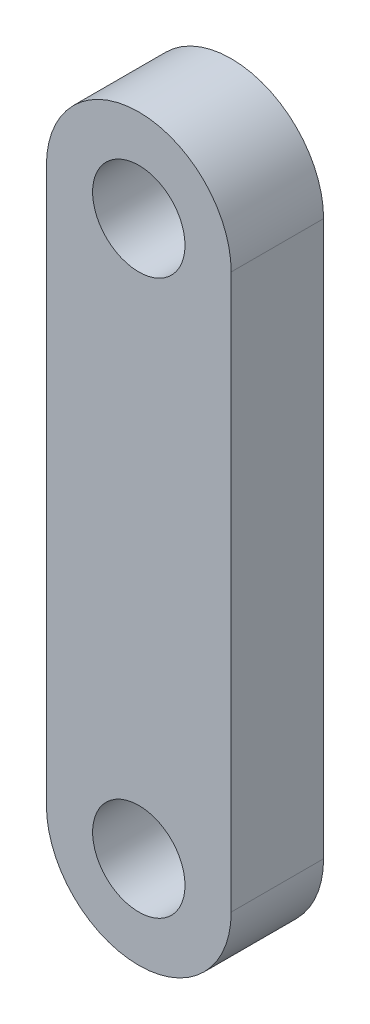
ISO-10303-21;
HEADER;
FILE_DESCRIPTION(('STEP AP214'),'2;1');
FILE_NAME('part.step','',(''),(''),'','','');
FILE_SCHEMA(('AUTOMOTIVE_DESIGN { 1 0 10303 214 1 1 1 1 }'));
ENDSEC;
DATA;
#1=APPLICATION_CONTEXT('core data for automotive mechanical design processes');
#2=APPLICATION_PROTOCOL_DEFINITION('international standard','automotive_design',2000,#1);
#3=PRODUCT_CONTEXT('',#1,'mechanical');
#4=PRODUCT('Part','Part','',(#3));
#5=PRODUCT_RELATED_PRODUCT_CATEGORY('part','',(#4));
#6=PRODUCT_DEFINITION_FORMATION('','',#4);
#7=PRODUCT_DEFINITION_CONTEXT('part definition',#1,'design');
#8=PRODUCT_DEFINITION('design','',#6,#7);
#9=PRODUCT_DEFINITION_SHAPE('','',#8);
#10=(LENGTH_UNIT() NAMED_UNIT(*) SI_UNIT(.MILLI.,.METRE.));
#11=(NAMED_UNIT(*) PLANE_ANGLE_UNIT() SI_UNIT($,.RADIAN.));
#12=(NAMED_UNIT(*) SI_UNIT($,.STERADIAN.) SOLID_ANGLE_UNIT());
#13=UNCERTAINTY_MEASURE_WITH_UNIT(LENGTH_MEASURE(1.E-05),#10,'distance_accuracy_value','');
#14=(GEOMETRIC_REPRESENTATION_CONTEXT(3) GLOBAL_UNCERTAINTY_ASSIGNED_CONTEXT((#13)) GLOBAL_UNIT_ASSIGNED_CONTEXT((#10,
#11,#12)) REPRESENTATION_CONTEXT('',''));
#15=CARTESIAN_POINT('',(0.,0.,0.));
#16=DIRECTION('',(0.,0.,1.));
#17=DIRECTION('',(1.,0.,0.));
#18=AXIS2_PLACEMENT_3D('',#15,#16,#17);
#19=CARTESIAN_POINT('',(0.,0.,10.));
#20=DIRECTION('',(0.,0.,1.));
#21=DIRECTION('',(1.,0.,0.));
#22=AXIS2_PLACEMENT_3D('',#19,#20,#21);
#23=PLANE('',#22);
#24=CARTESIAN_POINT('',(0.,0.,10.));
#25=DIRECTION('',(0.,0.,1.));
#26=DIRECTION('',(1.,0.,0.));
#27=AXIS2_PLACEMENT_3D('',#24,#25,#26);
#28=CIRCLE('',#27,2.5);
#29=CARTESIAN_POINT('',(2.5,0.,10.));
#30=VERTEX_POINT('',#29);
#31=EDGE_CURVE('E106',#30,#30,#28,.T.);
#32=ORIENTED_EDGE('',*,*,#31,.F.);
#33=EDGE_LOOP('',(#32));
#34=FACE_BOUND('',#33,.T.);
#35=CARTESIAN_POINT('',(0.,0.,10.));
#36=DIRECTION('',(0.,0.,1.));
#37=DIRECTION('',(1.,0.,0.));
#38=AXIS2_PLACEMENT_3D('',#35,#36,#37);
#39=CIRCLE('',#38,5.);
#40=CARTESIAN_POINT('',(-5.,0.,10.));
#41=VERTEX_POINT('',#40);
#42=CARTESIAN_POINT('',(5.,0.,10.));
#43=VERTEX_POINT('',#42);
#44=EDGE_CURVE('E91',#41,#43,#39,.T.);
#45=ORIENTED_EDGE('',*,*,#44,.T.);
#46=DIRECTION('',(0.,1.,0.));
#47=VECTOR('',#46,1.);
#48=CARTESIAN_POINT('',(5.,0.,10.));
#49=LINE('',#48,#47);
#50=CARTESIAN_POINT('',(5.,30.,10.));
#51=VERTEX_POINT('',#50);
#52=EDGE_CURVE('E86',#43,#51,#49,.T.);
#53=ORIENTED_EDGE('',*,*,#52,.T.);
#54=CARTESIAN_POINT('',(0.,30.,10.));
#55=DIRECTION('',(0.,0.,1.));
#56=DIRECTION('',(1.,0.,0.));
#57=AXIS2_PLACEMENT_3D('',#54,#55,#56);
#58=CIRCLE('',#57,5.);
#59=CARTESIAN_POINT('',(-5.,30.,10.));
#60=VERTEX_POINT('',#59);
#61=EDGE_CURVE('E89',#51,#60,#58,.T.);
#62=ORIENTED_EDGE('',*,*,#61,.T.);
#63=DIRECTION('',(0.,-1.,0.));
#64=VECTOR('',#63,1.);
#65=CARTESIAN_POINT('',(-5.,0.,10.));
#66=LINE('',#65,#64);
#67=EDGE_CURVE('E56',#60,#41,#66,.T.);
#68=ORIENTED_EDGE('',*,*,#67,.T.);
#69=EDGE_LOOP('',(#45,#53,#62,#68));
#70=FACE_BOUND('',#69,.T.);
#71=CARTESIAN_POINT('',(0.,30.,10.));
#72=DIRECTION('',(0.,0.,1.));
#73=DIRECTION('',(1.,0.,0.));
#74=AXIS2_PLACEMENT_3D('',#71,#72,#73);
#75=CIRCLE('',#74,2.5);
#76=CARTESIAN_POINT('',(2.5,30.,10.));
#77=VERTEX_POINT('',#76);
#78=EDGE_CURVE('E121',#77,#77,#75,.T.);
#79=ORIENTED_EDGE('',*,*,#78,.F.);
#80=EDGE_LOOP('',(#79));
#81=FACE_BOUND('',#80,.T.);
#82=ADVANCED_FACE('F39',(#34,#70,#81),#23,.T.);
#83=CARTESIAN_POINT('',(0.,0.,5.));
#84=DIRECTION('',(0.,0.,1.));
#85=DIRECTION('',(1.,0.,0.));
#86=AXIS2_PLACEMENT_3D('',#83,#84,#85);
#87=PLANE('',#86);
#88=CARTESIAN_POINT('',(0.,0.,5.));
#89=DIRECTION('',(0.,0.,1.));
#90=DIRECTION('',(1.,0.,0.));
#91=AXIS2_PLACEMENT_3D('',#88,#89,#90);
#92=CIRCLE('',#91,5.);
#93=CARTESIAN_POINT('',(-5.,0.,5.));
#94=VERTEX_POINT('',#93);
#95=CARTESIAN_POINT('',(5.,0.,5.));
#96=VERTEX_POINT('',#95);
#97=EDGE_CURVE('E103',#94,#96,#92,.T.);
#98=ORIENTED_EDGE('',*,*,#97,.F.);
#99=DIRECTION('',(0.,-1.,0.));
#100=VECTOR('',#99,1.);
#101=CARTESIAN_POINT('',(-5.,0.,5.));
#102=LINE('',#101,#100);
#103=CARTESIAN_POINT('',(-5.,30.,5.));
#104=VERTEX_POINT('',#103);
#105=EDGE_CURVE('E79',#104,#94,#102,.T.);
#106=ORIENTED_EDGE('',*,*,#105,.F.);
#107=CARTESIAN_POINT('',(0.,30.,5.));
#108=DIRECTION('',(0.,0.,1.));
#109=DIRECTION('',(1.,0.,0.));
#110=AXIS2_PLACEMENT_3D('',#107,#108,#109);
#111=CIRCLE('',#110,5.);
#112=CARTESIAN_POINT('',(5.,30.,5.));
#113=VERTEX_POINT('',#112);
#114=EDGE_CURVE('E73',#113,#104,#111,.T.);
#115=ORIENTED_EDGE('',*,*,#114,.F.);
#116=DIRECTION('',(0.,1.,0.));
#117=VECTOR('',#116,1.);
#118=CARTESIAN_POINT('',(5.,0.,5.));
#119=LINE('',#118,#117);
#120=EDGE_CURVE('E95',#96,#113,#119,.T.);
#121=ORIENTED_EDGE('',*,*,#120,.F.);
#122=EDGE_LOOP('',(#98,#106,#115,#121));
#123=FACE_BOUND('',#122,.T.);
#124=CARTESIAN_POINT('',(0.,0.,5.));
#125=DIRECTION('',(0.,0.,1.));
#126=DIRECTION('',(1.,0.,0.));
#127=AXIS2_PLACEMENT_3D('',#124,#125,#126);
#128=CIRCLE('',#127,2.5);
#129=CARTESIAN_POINT('',(2.5,0.,5.));
#130=VERTEX_POINT('',#129);
#131=EDGE_CURVE('E118',#130,#130,#128,.T.);
#132=ORIENTED_EDGE('',*,*,#131,.T.);
#133=EDGE_LOOP('',(#132));
#134=FACE_BOUND('',#133,.T.);
#135=CARTESIAN_POINT('',(0.,30.,5.));
#136=DIRECTION('',(0.,0.,1.));
#137=DIRECTION('',(1.,0.,0.));
#138=AXIS2_PLACEMENT_3D('',#135,#136,#137);
#139=CIRCLE('',#138,2.5);
#140=CARTESIAN_POINT('',(2.5,30.,5.));
#141=VERTEX_POINT('',#140);
#142=EDGE_CURVE('E124',#141,#141,#139,.T.);
#143=ORIENTED_EDGE('',*,*,#142,.T.);
#144=EDGE_LOOP('',(#143));
#145=FACE_BOUND('',#144,.T.);
#146=ADVANCED_FACE('F114',(#123,#134,#145),#87,.F.);
#147=CARTESIAN_POINT('',(0.,0.,10.));
#148=DIRECTION('',(0.,0.,-1.));
#149=DIRECTION('',(-1.,0.,0.));
#150=AXIS2_PLACEMENT_3D('',#147,#148,#149);
#151=CYLINDRICAL_SURFACE('',#150,5.);
#152=ORIENTED_EDGE('',*,*,#97,.T.);
#153=DIRECTION('',(0.,0.,-1.));
#154=VECTOR('',#153,1.);
#155=CARTESIAN_POINT('',(5.,0.,10.));
#156=LINE('',#155,#154);
#157=EDGE_CURVE('E11',#43,#96,#156,.T.);
#158=ORIENTED_EDGE('',*,*,#157,.F.);
#159=ORIENTED_EDGE('',*,*,#44,.F.);
#160=DIRECTION('',(0.,0.,-1.));
#161=VECTOR('',#160,1.);
#162=CARTESIAN_POINT('',(-5.,0.,10.));
#163=LINE('',#162,#161);
#164=EDGE_CURVE('E99',#41,#94,#163,.T.);
#165=ORIENTED_EDGE('',*,*,#164,.T.);
#166=EDGE_LOOP('',(#152,#158,#159,#165));
#167=FACE_BOUND('',#166,.T.);
#168=ADVANCED_FACE('F41',(#167),#151,.T.);
#169=CARTESIAN_POINT('',(5.,0.,10.));
#170=DIRECTION('',(-1.,0.,0.));
#171=DIRECTION('',(0.,0.,1.));
#172=AXIS2_PLACEMENT_3D('',#169,#170,#171);
#173=PLANE('',#172);
#174=ORIENTED_EDGE('',*,*,#120,.T.);
#175=DIRECTION('',(0.,0.,-1.));
#176=VECTOR('',#175,1.);
#177=CARTESIAN_POINT('',(5.,30.,10.));
#178=LINE('',#177,#176);
#179=EDGE_CURVE('E48',#51,#113,#178,.T.);
#180=ORIENTED_EDGE('',*,*,#179,.F.);
#181=ORIENTED_EDGE('',*,*,#52,.F.);
#182=ORIENTED_EDGE('',*,*,#157,.T.);
#183=EDGE_LOOP('',(#174,#180,#181,#182));
#184=FACE_BOUND('',#183,.T.);
#185=ADVANCED_FACE('F94',(#184),#173,.F.);
#186=CARTESIAN_POINT('',(0.,30.,10.));
#187=DIRECTION('',(0.,0.,-1.));
#188=DIRECTION('',(-1.,0.,0.));
#189=AXIS2_PLACEMENT_3D('',#186,#187,#188);
#190=CYLINDRICAL_SURFACE('',#189,5.);
#191=ORIENTED_EDGE('',*,*,#114,.T.);
#192=DIRECTION('',(0.,0.,-1.));
#193=VECTOR('',#192,1.);
#194=CARTESIAN_POINT('',(-5.,30.,10.));
#195=LINE('',#194,#193);
#196=EDGE_CURVE('E96',#60,#104,#195,.T.);
#197=ORIENTED_EDGE('',*,*,#196,.F.);
#198=ORIENTED_EDGE('',*,*,#61,.F.);
#199=ORIENTED_EDGE('',*,*,#179,.T.);
#200=EDGE_LOOP('',(#191,#197,#198,#199));
#201=FACE_BOUND('',#200,.T.);
#202=ADVANCED_FACE('F97',(#201),#190,.T.);
#203=CARTESIAN_POINT('',(-5.,0.,10.));
#204=DIRECTION('',(1.,0.,0.));
#205=DIRECTION('',(0.,0.,-1.));
#206=AXIS2_PLACEMENT_3D('',#203,#204,#205);
#207=PLANE('',#206);
#208=ORIENTED_EDGE('',*,*,#105,.T.);
#209=ORIENTED_EDGE('',*,*,#164,.F.);
#210=ORIENTED_EDGE('',*,*,#67,.F.);
#211=ORIENTED_EDGE('',*,*,#196,.T.);
#212=EDGE_LOOP('',(#208,#209,#210,#211));
#213=FACE_BOUND('',#212,.T.);
#214=ADVANCED_FACE('F111',(#213),#207,.F.);
#215=CARTESIAN_POINT('',(0.,0.,10.));
#216=DIRECTION('',(0.,0.,-1.));
#217=DIRECTION('',(-1.,0.,0.));
#218=AXIS2_PLACEMENT_3D('',#215,#216,#217);
#219=CYLINDRICAL_SURFACE('',#218,2.5);
#220=ORIENTED_EDGE('',*,*,#31,.T.);
#221=EDGE_LOOP('',(#220));
#222=FACE_BOUND('',#221,.T.);
#223=ORIENTED_EDGE('',*,*,#131,.F.);
#224=EDGE_LOOP('',(#223));
#225=FACE_BOUND('',#224,.T.);
#226=ADVANCED_FACE('F141',(#222,#225),#219,.F.);
#227=CARTESIAN_POINT('',(0.,30.,10.));
#228=DIRECTION('',(0.,0.,-1.));
#229=DIRECTION('',(-1.,0.,0.));
#230=AXIS2_PLACEMENT_3D('',#227,#228,#229);
#231=CYLINDRICAL_SURFACE('',#230,2.5);
#232=ORIENTED_EDGE('',*,*,#78,.T.);
#233=EDGE_LOOP('',(#232));
#234=FACE_BOUND('',#233,.T.);
#235=ORIENTED_EDGE('',*,*,#142,.F.);
#236=EDGE_LOOP('',(#235));
#237=FACE_BOUND('',#236,.T.);
#238=ADVANCED_FACE('F130',(#234,#237),#231,.F.);
#239=CLOSED_SHELL('',(#82,#146,#168,#185,#202,#214,#226,#238));
#240=MANIFOLD_SOLID_BREP('B2',#239);
#241=ADVANCED_BREP_SHAPE_REPRESENTATION('',(#18,#240),#14);
#242=SHAPE_DEFINITION_REPRESENTATION(#9,#241);
ENDSEC;
END-ISO-10303-21;
